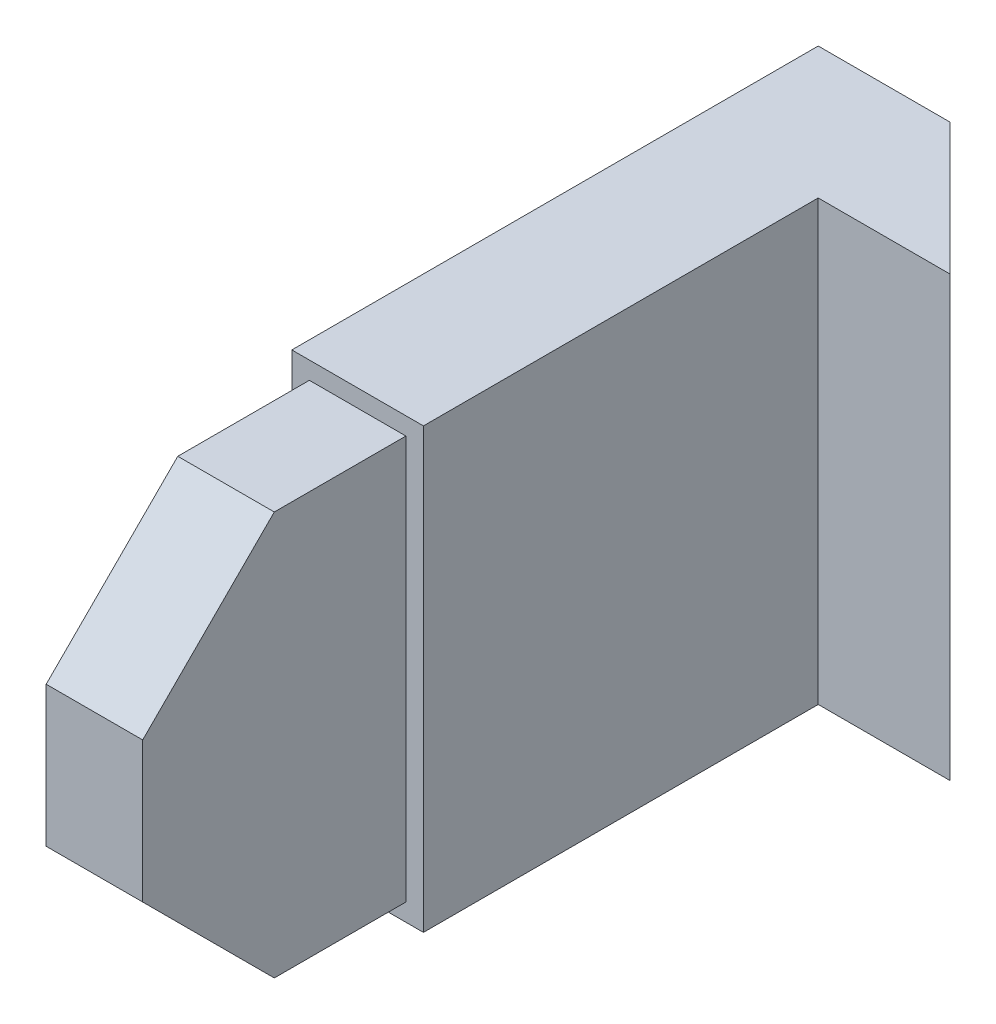
ISO-10303-21;
HEADER;
FILE_DESCRIPTION(('STEP AP214'),'2;1');
FILE_NAME('part.step','',(''),(''),'','','');
FILE_SCHEMA(('AUTOMOTIVE_DESIGN { 1 0 10303 214 1 1 1 1 }'));
ENDSEC;
DATA;
#1=APPLICATION_CONTEXT('core data for automotive mechanical design processes');
#2=APPLICATION_PROTOCOL_DEFINITION('international standard','automotive_design',2000,#1);
#3=PRODUCT_CONTEXT('',#1,'mechanical');
#4=PRODUCT('Part','Part','',(#3));
#5=PRODUCT_RELATED_PRODUCT_CATEGORY('part','',(#4));
#6=PRODUCT_DEFINITION_FORMATION('','',#4);
#7=PRODUCT_DEFINITION_CONTEXT('part definition',#1,'design');
#8=PRODUCT_DEFINITION('design','',#6,#7);
#9=PRODUCT_DEFINITION_SHAPE('','',#8);
#10=(LENGTH_UNIT() NAMED_UNIT(*) SI_UNIT(.MILLI.,.METRE.));
#11=(NAMED_UNIT(*) PLANE_ANGLE_UNIT() SI_UNIT($,.RADIAN.));
#12=(NAMED_UNIT(*) SI_UNIT($,.STERADIAN.) SOLID_ANGLE_UNIT());
#13=UNCERTAINTY_MEASURE_WITH_UNIT(LENGTH_MEASURE(1.E-05),#10,'distance_accuracy_value','');
#14=(GEOMETRIC_REPRESENTATION_CONTEXT(3) GLOBAL_UNCERTAINTY_ASSIGNED_CONTEXT((#13)) GLOBAL_UNIT_ASSIGNED_CONTEXT((#10,
#11,#12)) REPRESENTATION_CONTEXT('',''));
#15=CARTESIAN_POINT('',(0.,0.,0.));
#16=DIRECTION('',(0.,0.,1.));
#17=DIRECTION('',(1.,0.,0.));
#18=AXIS2_PLACEMENT_3D('',#15,#16,#17);
#19=CARTESIAN_POINT('',(-0.549999999999999,4.8,6.));
#20=DIRECTION('',(1.,0.,0.));
#21=DIRECTION('',(0.,0.,-1.));
#22=AXIS2_PLACEMENT_3D('',#19,#20,#21);
#23=PLANE('',#22);
#24=DIRECTION('',(0.,0.707106781186548,0.707106781186547));
#25=VECTOR('',#24,1.);
#26=CARTESIAN_POINT('',(-0.549999999999999,1.7,6.));
#27=LINE('',#26,#25);
#28=CARTESIAN_POINT('',(-0.549999999999999,0.200000000000001,4.5));
#29=VERTEX_POINT('',#28);
#30=CARTESIAN_POINT('',(-0.549999999999999,1.7,6.));
#31=VERTEX_POINT('',#30);
#32=EDGE_CURVE('E126',#29,#31,#27,.T.);
#33=ORIENTED_EDGE('',*,*,#32,.T.);
#34=DIRECTION('',(0.,-1.,0.));
#35=VECTOR('',#34,1.);
#36=CARTESIAN_POINT('',(-0.549999999999999,4.8,6.));
#37=LINE('',#36,#35);
#38=CARTESIAN_POINT('',(-0.549999999999999,3.3,6.));
#39=VERTEX_POINT('',#38);
#40=EDGE_CURVE('E137',#39,#31,#37,.T.);
#41=ORIENTED_EDGE('',*,*,#40,.F.);
#42=DIRECTION('',(0.,-0.707106781186548,0.707106781186547));
#43=VECTOR('',#42,1.);
#44=CARTESIAN_POINT('',(-0.549999999999999,3.3,6.));
#45=LINE('',#44,#43);
#46=CARTESIAN_POINT('',(-0.549999999999999,4.8,4.5));
#47=VERTEX_POINT('',#46);
#48=EDGE_CURVE('E60',#47,#39,#45,.T.);
#49=ORIENTED_EDGE('',*,*,#48,.F.);
#50=DIRECTION('',(0.,0.,-1.));
#51=VECTOR('',#50,1.);
#52=CARTESIAN_POINT('',(-0.549999999999999,4.8,6.));
#53=LINE('',#52,#51);
#54=CARTESIAN_POINT('',(-0.549999999999999,4.8,3.));
#55=VERTEX_POINT('',#54);
#56=EDGE_CURVE('E146',#47,#55,#53,.T.);
#57=ORIENTED_EDGE('',*,*,#56,.T.);
#58=DIRECTION('',(0.,-1.,0.));
#59=VECTOR('',#58,1.);
#60=CARTESIAN_POINT('',(-0.549999999999999,4.8,3.));
#61=LINE('',#60,#59);
#62=CARTESIAN_POINT('',(-0.549999999999999,0.2,3.));
#63=VERTEX_POINT('',#62);
#64=EDGE_CURVE('E154',#55,#63,#61,.T.);
#65=ORIENTED_EDGE('',*,*,#64,.T.);
#66=DIRECTION('',(0.,0.,-1.));
#67=VECTOR('',#66,1.);
#68=CARTESIAN_POINT('',(-0.549999999999999,0.2,6.));
#69=LINE('',#68,#67);
#70=EDGE_CURVE('E139',#29,#63,#69,.T.);
#71=ORIENTED_EDGE('',*,*,#70,.F.);
#72=EDGE_LOOP('',(#33,#41,#49,#57,#65,#71));
#73=FACE_BOUND('',#72,.T.);
#74=ADVANCED_FACE('F37',(#73),#23,.F.);
#75=CARTESIAN_POINT('',(-0.549999999999999,0.2,6.));
#76=DIRECTION('',(0.,1.,0.));
#77=DIRECTION('',(0.,0.,1.));
#78=AXIS2_PLACEMENT_3D('',#75,#76,#77);
#79=PLANE('',#78);
#80=DIRECTION('',(1.,0.,0.));
#81=VECTOR('',#80,1.);
#82=CARTESIAN_POINT('',(-0.751,0.200000000000001,4.5));
#83=LINE('',#82,#81);
#84=CARTESIAN_POINT('',(0.55,0.200000000000001,4.5));
#85=VERTEX_POINT('',#84);
#86=EDGE_CURVE('E132',#29,#85,#83,.T.);
#87=ORIENTED_EDGE('',*,*,#86,.F.);
#88=ORIENTED_EDGE('',*,*,#70,.T.);
#89=DIRECTION('',(1.,0.,0.));
#90=VECTOR('',#89,1.);
#91=CARTESIAN_POINT('',(-0.549999999999999,0.2,3.));
#92=LINE('',#91,#90);
#93=CARTESIAN_POINT('',(0.55,0.2,3.));
#94=VERTEX_POINT('',#93);
#95=EDGE_CURVE('E156',#63,#94,#92,.T.);
#96=ORIENTED_EDGE('',*,*,#95,.T.);
#97=DIRECTION('',(0.,0.,-1.));
#98=VECTOR('',#97,1.);
#99=CARTESIAN_POINT('',(0.55,0.2,6.));
#100=LINE('',#99,#98);
#101=EDGE_CURVE('E164',#85,#94,#100,.T.);
#102=ORIENTED_EDGE('',*,*,#101,.F.);
#103=EDGE_LOOP('',(#87,#88,#96,#102));
#104=FACE_BOUND('',#103,.T.);
#105=ADVANCED_FACE('F248',(#104),#79,.F.);
#106=CARTESIAN_POINT('',(0.55,0.2,6.));
#107=DIRECTION('',(-1.,0.,0.));
#108=DIRECTION('',(0.,0.,1.));
#109=AXIS2_PLACEMENT_3D('',#106,#107,#108);
#110=PLANE('',#109);
#111=DIRECTION('',(0.,-0.707106781186548,-0.707106781186547));
#112=VECTOR('',#111,1.);
#113=CARTESIAN_POINT('',(0.55,1.7,6.));
#114=LINE('',#113,#112);
#115=CARTESIAN_POINT('',(0.55,1.7,6.));
#116=VERTEX_POINT('',#115);
#117=EDGE_CURVE('E52',#116,#85,#114,.T.);
#118=ORIENTED_EDGE('',*,*,#117,.T.);
#119=ORIENTED_EDGE('',*,*,#101,.T.);
#120=DIRECTION('',(0.,1.,0.));
#121=VECTOR('',#120,1.);
#122=CARTESIAN_POINT('',(0.55,0.2,3.));
#123=LINE('',#122,#121);
#124=CARTESIAN_POINT('',(0.55,4.8,3.));
#125=VERTEX_POINT('',#124);
#126=EDGE_CURVE('E149',#94,#125,#123,.T.);
#127=ORIENTED_EDGE('',*,*,#126,.T.);
#128=DIRECTION('',(0.,0.,-1.));
#129=VECTOR('',#128,1.);
#130=CARTESIAN_POINT('',(0.55,4.8,6.));
#131=LINE('',#130,#129);
#132=CARTESIAN_POINT('',(0.55,4.8,4.5));
#133=VERTEX_POINT('',#132);
#134=EDGE_CURVE('E162',#133,#125,#131,.T.);
#135=ORIENTED_EDGE('',*,*,#134,.F.);
#136=DIRECTION('',(0.,0.707106781186548,-0.707106781186547));
#137=VECTOR('',#136,1.);
#138=CARTESIAN_POINT('',(0.55,3.3,6.));
#139=LINE('',#138,#137);
#140=CARTESIAN_POINT('',(0.55,3.3,6.));
#141=VERTEX_POINT('',#140);
#142=EDGE_CURVE('E131',#141,#133,#139,.T.);
#143=ORIENTED_EDGE('',*,*,#142,.F.);
#144=DIRECTION('',(0.,1.,0.));
#145=VECTOR('',#144,1.);
#146=CARTESIAN_POINT('',(0.55,0.2,6.));
#147=LINE('',#146,#145);
#148=EDGE_CURVE('E143',#116,#141,#147,.T.);
#149=ORIENTED_EDGE('',*,*,#148,.F.);
#150=EDGE_LOOP('',(#118,#119,#127,#135,#143,#149));
#151=FACE_BOUND('',#150,.T.);
#152=ADVANCED_FACE('F254',(#151),#110,.F.);
#153=CARTESIAN_POINT('',(0.,0.,6.));
#154=DIRECTION('',(0.,0.,1.));
#155=DIRECTION('',(1.,0.,0.));
#156=AXIS2_PLACEMENT_3D('',#153,#154,#155);
#157=PLANE('',#156);
#158=ORIENTED_EDGE('',*,*,#40,.T.);
#159=DIRECTION('',(1.,0.,0.));
#160=VECTOR('',#159,1.);
#161=CARTESIAN_POINT('',(-0.751,1.7,6.));
#162=LINE('',#161,#160);
#163=EDGE_CURVE('E123',#31,#116,#162,.T.);
#164=ORIENTED_EDGE('',*,*,#163,.T.);
#165=ORIENTED_EDGE('',*,*,#148,.T.);
#166=DIRECTION('',(1.,0.,0.));
#167=VECTOR('',#166,1.);
#168=CARTESIAN_POINT('',(-0.751,3.3,6.));
#169=LINE('',#168,#167);
#170=EDGE_CURVE('E142',#39,#141,#169,.T.);
#171=ORIENTED_EDGE('',*,*,#170,.F.);
#172=EDGE_LOOP('',(#158,#164,#165,#171));
#173=FACE_BOUND('',#172,.T.);
#174=ADVANCED_FACE('F141',(#173),#157,.T.);
#175=CARTESIAN_POINT('',(0.,5.,3.));
#176=DIRECTION('',(0.,0.,-1.));
#177=DIRECTION('',(-1.,0.,0.));
#178=AXIS2_PLACEMENT_3D('',#175,#176,#177);
#179=PLANE('',#178);
#180=DIRECTION('',(1.,0.,0.));
#181=VECTOR('',#180,1.);
#182=CARTESIAN_POINT('',(0.,0.,3.));
#183=LINE('',#182,#181);
#184=CARTESIAN_POINT('',(-0.749999999999999,0.,3.));
#185=VERTEX_POINT('',#184);
#186=CARTESIAN_POINT('',(0.75,0.,3.));
#187=VERTEX_POINT('',#186);
#188=EDGE_CURVE('E172',#185,#187,#183,.T.);
#189=ORIENTED_EDGE('',*,*,#188,.T.);
#190=DIRECTION('',(0.,-1.,0.));
#191=VECTOR('',#190,1.);
#192=CARTESIAN_POINT('',(0.75,5.,3.));
#193=LINE('',#192,#191);
#194=CARTESIAN_POINT('',(0.75,5.,3.));
#195=VERTEX_POINT('',#194);
#196=EDGE_CURVE('E183',#195,#187,#193,.T.);
#197=ORIENTED_EDGE('',*,*,#196,.F.);
#198=DIRECTION('',(1.,0.,0.));
#199=VECTOR('',#198,1.);
#200=CARTESIAN_POINT('',(0.,5.,3.));
#201=LINE('',#200,#199);
#202=CARTESIAN_POINT('',(-0.749999999999999,5.,3.));
#203=VERTEX_POINT('',#202);
#204=EDGE_CURVE('E181',#203,#195,#201,.T.);
#205=ORIENTED_EDGE('',*,*,#204,.F.);
#206=DIRECTION('',(0.,-1.,0.));
#207=VECTOR('',#206,1.);
#208=CARTESIAN_POINT('',(-0.749999999999999,5.,3.));
#209=LINE('',#208,#207);
#210=EDGE_CURVE('E199',#203,#185,#209,.T.);
#211=ORIENTED_EDGE('',*,*,#210,.T.);
#212=EDGE_LOOP('',(#189,#197,#205,#211));
#213=FACE_BOUND('',#212,.T.);
#214=ORIENTED_EDGE('',*,*,#64,.F.);
#215=DIRECTION('',(-1.,0.,0.));
#216=VECTOR('',#215,1.);
#217=CARTESIAN_POINT('',(0.55,4.8,3.));
#218=LINE('',#217,#216);
#219=EDGE_CURVE('E144',#125,#55,#218,.T.);
#220=ORIENTED_EDGE('',*,*,#219,.F.);
#221=ORIENTED_EDGE('',*,*,#126,.F.);
#222=ORIENTED_EDGE('',*,*,#95,.F.);
#223=EDGE_LOOP('',(#214,#220,#221,#222));
#224=FACE_BOUND('',#223,.T.);
#225=ADVANCED_FACE('F233',(#213,#224),#179,.F.);
#226=CARTESIAN_POINT('',(0.75,5.,0.));
#227=DIRECTION('',(1.,0.,0.));
#228=DIRECTION('',(0.,0.,-1.));
#229=AXIS2_PLACEMENT_3D('',#226,#227,#228);
#230=PLANE('',#229);
#231=DIRECTION('',(0.,0.,1.));
#232=VECTOR('',#231,1.);
#233=CARTESIAN_POINT('',(0.75,0.,0.));
#234=LINE('',#233,#232);
#235=CARTESIAN_POINT('',(0.75,0.,-1.5));
#236=VERTEX_POINT('',#235);
#237=EDGE_CURVE('E167',#236,#187,#234,.T.);
#238=ORIENTED_EDGE('',*,*,#237,.F.);
#239=DIRECTION('',(0.,-1.,0.));
#240=VECTOR('',#239,1.);
#241=CARTESIAN_POINT('',(0.75,5.,-1.5));
#242=LINE('',#241,#240);
#243=CARTESIAN_POINT('',(0.75,5.,-1.5));
#244=VERTEX_POINT('',#243);
#245=EDGE_CURVE('E11',#244,#236,#242,.T.);
#246=ORIENTED_EDGE('',*,*,#245,.F.);
#247=DIRECTION('',(0.,0.,1.));
#248=VECTOR('',#247,1.);
#249=CARTESIAN_POINT('',(0.75,5.,0.));
#250=LINE('',#249,#248);
#251=EDGE_CURVE('E168',#244,#195,#250,.T.);
#252=ORIENTED_EDGE('',*,*,#251,.T.);
#253=ORIENTED_EDGE('',*,*,#196,.T.);
#254=EDGE_LOOP('',(#238,#246,#252,#253));
#255=FACE_BOUND('',#254,.T.);
#256=ADVANCED_FACE('F39',(#255),#230,.T.);
#257=CARTESIAN_POINT('',(0.,5.,-1.5));
#258=DIRECTION('',(0.,0.,-1.));
#259=DIRECTION('',(-1.,0.,0.));
#260=AXIS2_PLACEMENT_3D('',#257,#258,#259);
#261=PLANE('',#260);
#262=DIRECTION('',(1.,0.,0.));
#263=VECTOR('',#262,1.);
#264=CARTESIAN_POINT('',(0.,0.,-1.5));
#265=LINE('',#264,#263);
#266=CARTESIAN_POINT('',(2.25,0.,-1.5));
#267=VERTEX_POINT('',#266);
#268=EDGE_CURVE('E186',#236,#267,#265,.T.);
#269=ORIENTED_EDGE('',*,*,#268,.T.);
#270=DIRECTION('',(0.,-1.,0.));
#271=VECTOR('',#270,1.);
#272=CARTESIAN_POINT('',(2.25,5.,-1.5));
#273=LINE('',#272,#271);
#274=CARTESIAN_POINT('',(2.25,5.,-1.5));
#275=VERTEX_POINT('',#274);
#276=EDGE_CURVE('E45',#275,#267,#273,.T.);
#277=ORIENTED_EDGE('',*,*,#276,.F.);
#278=DIRECTION('',(1.,0.,0.));
#279=VECTOR('',#278,1.);
#280=CARTESIAN_POINT('',(0.,5.,-1.5));
#281=LINE('',#280,#279);
#282=EDGE_CURVE('E171',#244,#275,#281,.T.);
#283=ORIENTED_EDGE('',*,*,#282,.F.);
#284=ORIENTED_EDGE('',*,*,#245,.T.);
#285=EDGE_LOOP('',(#269,#277,#283,#284));
#286=FACE_BOUND('',#285,.T.);
#287=ADVANCED_FACE('F229',(#286),#261,.F.);
#288=CARTESIAN_POINT('',(1.875,5.,-1.875));
#289=DIRECTION('',(-0.707106781186548,0.,0.707106781186547));
#290=DIRECTION('',(0.707106781186547,0.,0.707106781186548));
#291=AXIS2_PLACEMENT_3D('',#288,#289,#290);
#292=PLANE('',#291);
#293=DIRECTION('',(-0.707106781186547,0.,-0.707106781186548));
#294=VECTOR('',#293,1.);
#295=CARTESIAN_POINT('',(1.875,0.,-1.875));
#296=LINE('',#295,#294);
#297=CARTESIAN_POINT('',(0.75,0.,-3.));
#298=VERTEX_POINT('',#297);
#299=EDGE_CURVE('E188',#267,#298,#296,.T.);
#300=ORIENTED_EDGE('',*,*,#299,.T.);
#301=DIRECTION('',(0.,-1.,0.));
#302=VECTOR('',#301,1.);
#303=CARTESIAN_POINT('',(0.75,5.,-3.));
#304=LINE('',#303,#302);
#305=CARTESIAN_POINT('',(0.75,5.,-3.));
#306=VERTEX_POINT('',#305);
#307=EDGE_CURVE('E204',#306,#298,#304,.T.);
#308=ORIENTED_EDGE('',*,*,#307,.F.);
#309=DIRECTION('',(-0.707106781186547,0.,-0.707106781186548));
#310=VECTOR('',#309,1.);
#311=CARTESIAN_POINT('',(1.875,5.,-1.875));
#312=LINE('',#311,#310);
#313=EDGE_CURVE('E174',#275,#306,#312,.T.);
#314=ORIENTED_EDGE('',*,*,#313,.F.);
#315=ORIENTED_EDGE('',*,*,#276,.T.);
#316=EDGE_LOOP('',(#300,#308,#314,#315));
#317=FACE_BOUND('',#316,.T.);
#318=ADVANCED_FACE('F210',(#317),#292,.F.);
#319=CARTESIAN_POINT('',(0.,5.,-3.));
#320=DIRECTION('',(0.,0.,-1.));
#321=DIRECTION('',(-1.,0.,0.));
#322=AXIS2_PLACEMENT_3D('',#319,#320,#321);
#323=PLANE('',#322);
#324=DIRECTION('',(1.,0.,0.));
#325=VECTOR('',#324,1.);
#326=CARTESIAN_POINT('',(0.,0.,-3.));
#327=LINE('',#326,#325);
#328=CARTESIAN_POINT('',(-0.75,0.,-3.));
#329=VERTEX_POINT('',#328);
#330=EDGE_CURVE('E191',#329,#298,#327,.T.);
#331=ORIENTED_EDGE('',*,*,#330,.F.);
#332=DIRECTION('',(0.,-1.,0.));
#333=VECTOR('',#332,1.);
#334=CARTESIAN_POINT('',(-0.75,5.,-3.));
#335=LINE('',#334,#333);
#336=CARTESIAN_POINT('',(-0.75,5.,-3.));
#337=VERTEX_POINT('',#336);
#338=EDGE_CURVE('E202',#337,#329,#335,.T.);
#339=ORIENTED_EDGE('',*,*,#338,.F.);
#340=DIRECTION('',(1.,0.,0.));
#341=VECTOR('',#340,1.);
#342=CARTESIAN_POINT('',(0.,5.,-3.));
#343=LINE('',#342,#341);
#344=EDGE_CURVE('E176',#337,#306,#343,.T.);
#345=ORIENTED_EDGE('',*,*,#344,.T.);
#346=ORIENTED_EDGE('',*,*,#307,.T.);
#347=EDGE_LOOP('',(#331,#339,#345,#346));
#348=FACE_BOUND('',#347,.T.);
#349=ADVANCED_FACE('F222',(#348),#323,.T.);
#350=CARTESIAN_POINT('',(-0.75,5.,0.));
#351=DIRECTION('',(1.,0.,0.));
#352=DIRECTION('',(0.,0.,-1.));
#353=AXIS2_PLACEMENT_3D('',#350,#351,#352);
#354=PLANE('',#353);
#355=DIRECTION('',(0.,0.,1.));
#356=VECTOR('',#355,1.);
#357=CARTESIAN_POINT('',(-0.75,0.,0.));
#358=LINE('',#357,#356);
#359=EDGE_CURVE('E194',#329,#185,#358,.T.);
#360=ORIENTED_EDGE('',*,*,#359,.T.);
#361=ORIENTED_EDGE('',*,*,#210,.F.);
#362=DIRECTION('',(0.,0.,1.));
#363=VECTOR('',#362,1.);
#364=CARTESIAN_POINT('',(-0.75,5.,0.));
#365=LINE('',#364,#363);
#366=EDGE_CURVE('E179',#337,#203,#365,.T.);
#367=ORIENTED_EDGE('',*,*,#366,.F.);
#368=ORIENTED_EDGE('',*,*,#338,.T.);
#369=EDGE_LOOP('',(#360,#361,#367,#368));
#370=FACE_BOUND('',#369,.T.);
#371=ADVANCED_FACE('F237',(#370),#354,.F.);
#372=CARTESIAN_POINT('',(0.,5.,0.));
#373=DIRECTION('',(0.,1.,0.));
#374=DIRECTION('',(0.,0.,1.));
#375=AXIS2_PLACEMENT_3D('',#372,#373,#374);
#376=PLANE('',#375);
#377=ORIENTED_EDGE('',*,*,#251,.F.);
#378=ORIENTED_EDGE('',*,*,#282,.T.);
#379=ORIENTED_EDGE('',*,*,#313,.T.);
#380=ORIENTED_EDGE('',*,*,#344,.F.);
#381=ORIENTED_EDGE('',*,*,#366,.T.);
#382=ORIENTED_EDGE('',*,*,#204,.T.);
#383=EDGE_LOOP('',(#377,#378,#379,#380,#381,#382));
#384=FACE_BOUND('',#383,.T.);
#385=ADVANCED_FACE('F227',(#384),#376,.T.);
#386=CARTESIAN_POINT('',(0.,0.,0.));
#387=DIRECTION('',(0.,1.,0.));
#388=DIRECTION('',(0.,0.,1.));
#389=AXIS2_PLACEMENT_3D('',#386,#387,#388);
#390=PLANE('',#389);
#391=ORIENTED_EDGE('',*,*,#237,.T.);
#392=ORIENTED_EDGE('',*,*,#188,.F.);
#393=ORIENTED_EDGE('',*,*,#359,.F.);
#394=ORIENTED_EDGE('',*,*,#330,.T.);
#395=ORIENTED_EDGE('',*,*,#299,.F.);
#396=ORIENTED_EDGE('',*,*,#268,.F.);
#397=EDGE_LOOP('',(#391,#392,#393,#394,#395,#396));
#398=FACE_BOUND('',#397,.T.);
#399=ADVANCED_FACE('F216',(#398),#390,.F.);
#400=CARTESIAN_POINT('',(0.55,4.8,6.));
#401=DIRECTION('',(0.,-1.,0.));
#402=DIRECTION('',(0.,0.,-1.));
#403=AXIS2_PLACEMENT_3D('',#400,#401,#402);
#404=PLANE('',#403);
#405=ORIENTED_EDGE('',*,*,#56,.F.);
#406=DIRECTION('',(1.,0.,0.));
#407=VECTOR('',#406,1.);
#408=CARTESIAN_POINT('',(-0.751,4.8,4.5));
#409=LINE('',#408,#407);
#410=EDGE_CURVE('E283',#47,#133,#409,.T.);
#411=ORIENTED_EDGE('',*,*,#410,.T.);
#412=ORIENTED_EDGE('',*,*,#134,.T.);
#413=ORIENTED_EDGE('',*,*,#219,.T.);
#414=EDGE_LOOP('',(#405,#411,#412,#413));
#415=FACE_BOUND('',#414,.T.);
#416=ADVANCED_FACE('F260',(#415),#404,.F.);
#417=CARTESIAN_POINT('',(-0.751,3.3,6.));
#418=DIRECTION('',(0.,-0.707106781186547,-0.707106781186548));
#419=DIRECTION('',(0.,0.707106781186548,-0.707106781186547));
#420=AXIS2_PLACEMENT_3D('',#417,#418,#419);
#421=PLANE('',#420);
#422=ORIENTED_EDGE('',*,*,#48,.T.);
#423=ORIENTED_EDGE('',*,*,#170,.T.);
#424=ORIENTED_EDGE('',*,*,#142,.T.);
#425=ORIENTED_EDGE('',*,*,#410,.F.);
#426=EDGE_LOOP('',(#422,#423,#424,#425));
#427=FACE_BOUND('',#426,.T.);
#428=ADVANCED_FACE('F274',(#427),#421,.F.);
#429=CARTESIAN_POINT('',(-0.751,1.7,6.));
#430=DIRECTION('',(0.,-0.707106781186547,0.707106781186548));
#431=DIRECTION('',(0.,-0.707106781186548,-0.707106781186547));
#432=AXIS2_PLACEMENT_3D('',#429,#430,#431);
#433=PLANE('',#432);
#434=ORIENTED_EDGE('',*,*,#86,.T.);
#435=ORIENTED_EDGE('',*,*,#117,.F.);
#436=ORIENTED_EDGE('',*,*,#163,.F.);
#437=ORIENTED_EDGE('',*,*,#32,.F.);
#438=EDGE_LOOP('',(#434,#435,#436,#437));
#439=FACE_BOUND('',#438,.T.);
#440=ADVANCED_FACE('F125',(#439),#433,.T.);
#441=CLOSED_SHELL('',(#74,#105,#152,#174,#225,#256,#287,#318,#349,#371,#385,#399,#416,#428,#440));
#442=MANIFOLD_SOLID_BREP('B2',#441);
#443=ADVANCED_BREP_SHAPE_REPRESENTATION('',(#18,#442),#14);
#444=SHAPE_DEFINITION_REPRESENTATION(#9,#443);
ENDSEC;
END-ISO-10303-21;
